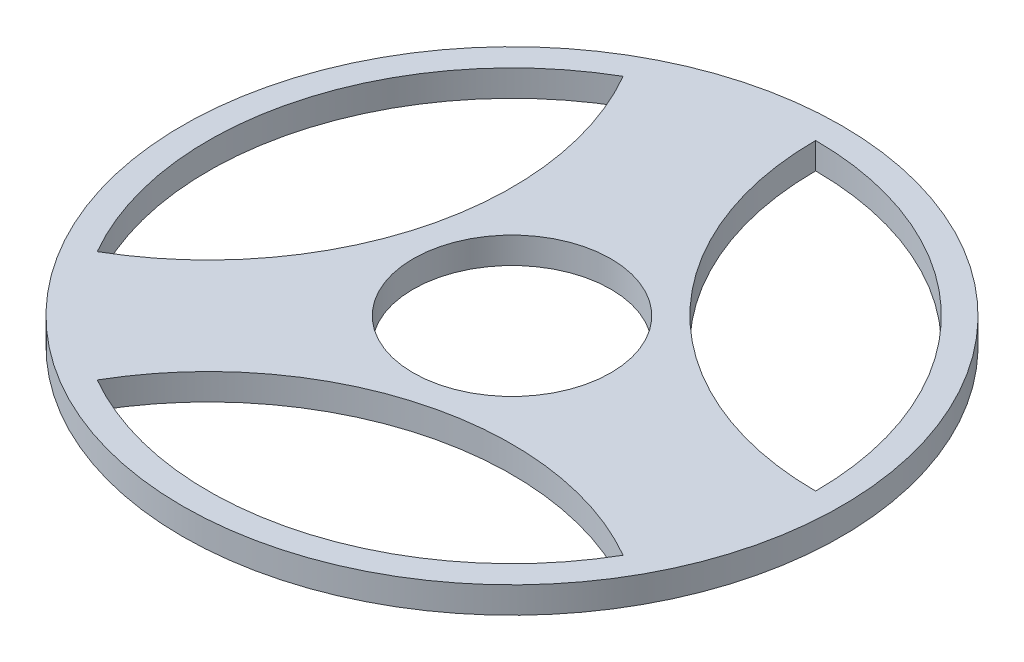
ISO-10303-21;
HEADER;
FILE_DESCRIPTION(('STEP AP214'),'2;1');
FILE_NAME('part.step','',(''),(''),'','','');
FILE_SCHEMA(('AUTOMOTIVE_DESIGN { 1 0 10303 214 1 1 1 1 }'));
ENDSEC;
DATA;
#1=APPLICATION_CONTEXT('core data for automotive mechanical design processes');
#2=APPLICATION_PROTOCOL_DEFINITION('international standard','automotive_design',2000,#1);
#3=PRODUCT_CONTEXT('',#1,'mechanical');
#4=PRODUCT('Part','Part','',(#3));
#5=PRODUCT_RELATED_PRODUCT_CATEGORY('part','',(#4));
#6=PRODUCT_DEFINITION_FORMATION('','',#4);
#7=PRODUCT_DEFINITION_CONTEXT('part definition',#1,'design');
#8=PRODUCT_DEFINITION('design','',#6,#7);
#9=PRODUCT_DEFINITION_SHAPE('','',#8);
#10=(LENGTH_UNIT() NAMED_UNIT(*) SI_UNIT(.MILLI.,.METRE.));
#11=(NAMED_UNIT(*) PLANE_ANGLE_UNIT() SI_UNIT($,.RADIAN.));
#12=(NAMED_UNIT(*) SI_UNIT($,.STERADIAN.) SOLID_ANGLE_UNIT());
#13=UNCERTAINTY_MEASURE_WITH_UNIT(LENGTH_MEASURE(1.E-05),#10,'distance_accuracy_value','');
#14=(GEOMETRIC_REPRESENTATION_CONTEXT(3) GLOBAL_UNCERTAINTY_ASSIGNED_CONTEXT((#13)) GLOBAL_UNIT_ASSIGNED_CONTEXT((#10,
#11,#12)) REPRESENTATION_CONTEXT('',''));
#15=CARTESIAN_POINT('',(0.,0.,0.));
#16=DIRECTION('',(0.,0.,1.));
#17=DIRECTION('',(1.,0.,0.));
#18=AXIS2_PLACEMENT_3D('',#15,#16,#17);
#19=CARTESIAN_POINT('',(460.646839850809,40.,-460.646839850809));
#20=DIRECTION('',(0.,-1.,0.));
#21=DIRECTION('',(0.,0.,-1.));
#22=AXIS2_PLACEMENT_3D('',#19,#20,#21);
#23=CYLINDRICAL_SURFACE('',#22,460.646839850809);
#24=CARTESIAN_POINT('',(460.646839850809,0.,-460.646839850809));
#25=DIRECTION('',(0.,1.,0.));
#26=DIRECTION('',(0.,0.,1.));
#27=AXIS2_PLACEMENT_3D('',#24,#25,#26);
#28=CIRCLE('',#27,460.646839850809);
#29=CARTESIAN_POINT('',(0.,0.,-460.646839850809));
#30=VERTEX_POINT('',#29);
#31=CARTESIAN_POINT('',(460.646839850809,0.,0.));
#32=VERTEX_POINT('',#31);
#33=EDGE_CURVE('E139',#30,#32,#28,.T.);
#34=ORIENTED_EDGE('',*,*,#33,.F.);
#35=DIRECTION('',(0.,-1.,0.));
#36=VECTOR('',#35,1.);
#37=CARTESIAN_POINT('',(0.,40.,-460.646839850809));
#38=LINE('',#37,#36);
#39=CARTESIAN_POINT('',(0.,40.,-460.646839850809));
#40=VERTEX_POINT('',#39);
#41=EDGE_CURVE('E11',#40,#30,#38,.T.);
#42=ORIENTED_EDGE('',*,*,#41,.F.);
#43=CARTESIAN_POINT('',(460.646839850809,40.,-460.646839850809));
#44=DIRECTION('',(0.,1.,0.));
#45=DIRECTION('',(0.,0.,1.));
#46=AXIS2_PLACEMENT_3D('',#43,#44,#45);
#47=CIRCLE('',#46,460.646839850809);
#48=CARTESIAN_POINT('',(460.646839850809,40.,0.));
#49=VERTEX_POINT('',#48);
#50=EDGE_CURVE('E102',#40,#49,#47,.T.);
#51=ORIENTED_EDGE('',*,*,#50,.T.);
#52=DIRECTION('',(0.,-1.,0.));
#53=VECTOR('',#52,1.);
#54=CARTESIAN_POINT('',(460.646839850809,40.,0.));
#55=LINE('',#54,#53);
#56=EDGE_CURVE('E45',#49,#32,#55,.T.);
#57=ORIENTED_EDGE('',*,*,#56,.T.);
#58=EDGE_LOOP('',(#34,#42,#51,#57));
#59=FACE_BOUND('',#58,.T.);
#60=ADVANCED_FACE('F35',(#59),#23,.F.);
#61=CARTESIAN_POINT('',(168.608445558415,40.,629.255285409229));
#62=DIRECTION('',(0.,-1.,0.));
#63=DIRECTION('',(0.,0.,-1.));
#64=AXIS2_PLACEMENT_3D('',#61,#62,#63);
#65=CYLINDRICAL_SURFACE('',#64,460.64683985081);
#66=CARTESIAN_POINT('',(168.608445558415,0.,629.255285409229));
#67=DIRECTION('',(0.,1.,0.));
#68=DIRECTION('',(0.,0.,1.));
#69=AXIS2_PLACEMENT_3D('',#66,#67,#68);
#70=CIRCLE('',#69,460.64683985081);
#71=CARTESIAN_POINT('',(398.931865483822,0.,230.323419925407));
#72=VERTEX_POINT('',#71);
#73=CARTESIAN_POINT('',(-230.323419925406,0.,398.931865483822));
#74=VERTEX_POINT('',#73);
#75=EDGE_CURVE('E136',#72,#74,#70,.T.);
#76=ORIENTED_EDGE('',*,*,#75,.F.);
#77=DIRECTION('',(0.,-1.,0.));
#78=VECTOR('',#77,1.);
#79=CARTESIAN_POINT('',(398.931865483822,40.,230.323419925407));
#80=LINE('',#79,#78);
#81=CARTESIAN_POINT('',(398.931865483822,40.,230.323419925407));
#82=VERTEX_POINT('',#81);
#83=EDGE_CURVE('E112',#82,#72,#80,.T.);
#84=ORIENTED_EDGE('',*,*,#83,.F.);
#85=CARTESIAN_POINT('',(168.608445558415,40.,629.255285409229));
#86=DIRECTION('',(0.,1.,0.));
#87=DIRECTION('',(0.,0.,1.));
#88=AXIS2_PLACEMENT_3D('',#85,#86,#87);
#89=CIRCLE('',#88,460.64683985081);
#90=CARTESIAN_POINT('',(-230.323419925406,40.,398.931865483822));
#91=VERTEX_POINT('',#90);
#92=EDGE_CURVE('E100',#82,#91,#89,.T.);
#93=ORIENTED_EDGE('',*,*,#92,.T.);
#94=DIRECTION('',(0.,-1.,0.));
#95=VECTOR('',#94,1.);
#96=CARTESIAN_POINT('',(-230.323419925406,40.,398.931865483822));
#97=LINE('',#96,#95);
#98=EDGE_CURVE('E105',#91,#74,#97,.T.);
#99=ORIENTED_EDGE('',*,*,#98,.T.);
#100=EDGE_LOOP('',(#76,#84,#93,#99));
#101=FACE_BOUND('',#100,.T.);
#102=ADVANCED_FACE('F114',(#101),#65,.F.);
#103=CARTESIAN_POINT('',(-629.255285409226,40.,-168.608445558424));
#104=DIRECTION('',(0.,-1.,0.));
#105=DIRECTION('',(0.,0.,-1.));
#106=AXIS2_PLACEMENT_3D('',#103,#104,#105);
#107=CYLINDRICAL_SURFACE('',#106,460.646839850809);
#108=CARTESIAN_POINT('',(-629.255285409226,0.,-168.608445558424));
#109=DIRECTION('',(0.,1.,0.));
#110=DIRECTION('',(0.,0.,1.));
#111=AXIS2_PLACEMENT_3D('',#108,#109,#110);
#112=CIRCLE('',#111,460.646839850809);
#113=CARTESIAN_POINT('',(-398.931865483823,0.,230.323419925405));
#114=VERTEX_POINT('',#113);
#115=CARTESIAN_POINT('',(-230.323419925405,0.,-398.931865483823));
#116=VERTEX_POINT('',#115);
#117=EDGE_CURVE('E130',#114,#116,#112,.T.);
#118=ORIENTED_EDGE('',*,*,#117,.F.);
#119=DIRECTION('',(0.,-1.,0.));
#120=VECTOR('',#119,1.);
#121=CARTESIAN_POINT('',(-398.931865483823,40.,230.323419925405));
#122=LINE('',#121,#120);
#123=CARTESIAN_POINT('',(-398.931865483823,40.,230.323419925405));
#124=VERTEX_POINT('',#123);
#125=EDGE_CURVE('E39',#124,#114,#122,.T.);
#126=ORIENTED_EDGE('',*,*,#125,.F.);
#127=CARTESIAN_POINT('',(-629.255285409226,40.,-168.608445558424));
#128=DIRECTION('',(0.,1.,0.));
#129=DIRECTION('',(0.,0.,1.));
#130=AXIS2_PLACEMENT_3D('',#127,#128,#129);
#131=CIRCLE('',#130,460.646839850809);
#132=CARTESIAN_POINT('',(-230.323419925405,40.,-398.931865483823));
#133=VERTEX_POINT('',#132);
#134=EDGE_CURVE('E117',#124,#133,#131,.T.);
#135=ORIENTED_EDGE('',*,*,#134,.T.);
#136=DIRECTION('',(0.,-1.,0.));
#137=VECTOR('',#136,1.);
#138=CARTESIAN_POINT('',(-230.323419925405,40.,-398.931865483823));
#139=LINE('',#138,#137);
#140=EDGE_CURVE('E129',#133,#116,#139,.T.);
#141=ORIENTED_EDGE('',*,*,#140,.T.);
#142=EDGE_LOOP('',(#118,#126,#135,#141));
#143=FACE_BOUND('',#142,.T.);
#144=ADVANCED_FACE('F37',(#143),#107,.F.);
#145=CARTESIAN_POINT('',(0.,40.,0.));
#146=DIRECTION('',(0.,-1.,0.));
#147=DIRECTION('',(0.,0.,-1.));
#148=AXIS2_PLACEMENT_3D('',#145,#146,#147);
#149=CYLINDRICAL_SURFACE('',#148,150.);
#150=CARTESIAN_POINT('',(0.,40.,0.));
#151=DIRECTION('',(0.,1.,0.));
#152=DIRECTION('',(0.,0.,1.));
#153=AXIS2_PLACEMENT_3D('',#150,#151,#152);
#154=CIRCLE('',#153,150.);
#155=CARTESIAN_POINT('',(0.,40.,150.));
#156=VERTEX_POINT('',#155);
#157=EDGE_CURVE('E123',#156,#156,#154,.T.);
#158=ORIENTED_EDGE('',*,*,#157,.T.);
#159=EDGE_LOOP('',(#158));
#160=FACE_BOUND('',#159,.T.);
#161=CARTESIAN_POINT('',(0.,0.,0.));
#162=DIRECTION('',(0.,1.,0.));
#163=DIRECTION('',(0.,0.,1.));
#164=AXIS2_PLACEMENT_3D('',#161,#162,#163);
#165=CIRCLE('',#164,150.);
#166=CARTESIAN_POINT('',(0.,0.,150.));
#167=VERTEX_POINT('',#166);
#168=EDGE_CURVE('E144',#167,#167,#165,.T.);
#169=ORIENTED_EDGE('',*,*,#168,.F.);
#170=EDGE_LOOP('',(#169));
#171=FACE_BOUND('',#170,.T.);
#172=ADVANCED_FACE('F160',(#160,#171),#149,.F.);
#173=CARTESIAN_POINT('',(0.,40.,0.));
#174=DIRECTION('',(0.,-1.,0.));
#175=DIRECTION('',(0.,0.,-1.));
#176=AXIS2_PLACEMENT_3D('',#173,#174,#175);
#177=CYLINDRICAL_SURFACE('',#176,460.646839850809);
#178=CARTESIAN_POINT('',(0.,0.,0.));
#179=DIRECTION('',(0.,1.,0.));
#180=DIRECTION('',(0.,0.,1.));
#181=AXIS2_PLACEMENT_3D('',#178,#179,#180);
#182=CIRCLE('',#181,460.646839850809);
#183=EDGE_CURVE('E142',#30,#32,#182,.F.);
#184=ORIENTED_EDGE('',*,*,#183,.T.);
#185=ORIENTED_EDGE('',*,*,#56,.F.);
#186=CARTESIAN_POINT('',(0.,40.,0.));
#187=DIRECTION('',(0.,1.,0.));
#188=DIRECTION('',(0.,0.,1.));
#189=AXIS2_PLACEMENT_3D('',#186,#187,#188);
#190=CIRCLE('',#189,460.646839850809);
#191=EDGE_CURVE('E53',#40,#49,#190,.F.);
#192=ORIENTED_EDGE('',*,*,#191,.F.);
#193=ORIENTED_EDGE('',*,*,#41,.T.);
#194=EDGE_LOOP('',(#184,#185,#192,#193));
#195=FACE_BOUND('',#194,.T.);
#196=ADVANCED_FACE('F165',(#195),#177,.F.);
#197=CARTESIAN_POINT('',(0.,40.,0.));
#198=DIRECTION('',(0.,-1.,0.));
#199=DIRECTION('',(0.,0.,-1.));
#200=AXIS2_PLACEMENT_3D('',#197,#198,#199);
#201=CYLINDRICAL_SURFACE('',#200,460.64683985081);
#202=CARTESIAN_POINT('',(0.,0.,0.));
#203=DIRECTION('',(0.,1.,0.));
#204=DIRECTION('',(0.,0.,1.));
#205=AXIS2_PLACEMENT_3D('',#202,#203,#204);
#206=CIRCLE('',#205,460.64683985081);
#207=EDGE_CURVE('E108',#72,#74,#206,.F.);
#208=ORIENTED_EDGE('',*,*,#207,.T.);
#209=ORIENTED_EDGE('',*,*,#98,.F.);
#210=CARTESIAN_POINT('',(0.,40.,0.));
#211=DIRECTION('',(0.,1.,0.));
#212=DIRECTION('',(0.,0.,1.));
#213=AXIS2_PLACEMENT_3D('',#210,#211,#212);
#214=CIRCLE('',#213,460.64683985081);
#215=EDGE_CURVE('E96',#82,#91,#214,.F.);
#216=ORIENTED_EDGE('',*,*,#215,.F.);
#217=ORIENTED_EDGE('',*,*,#83,.T.);
#218=EDGE_LOOP('',(#208,#209,#216,#217));
#219=FACE_BOUND('',#218,.T.);
#220=ADVANCED_FACE('F106',(#219),#201,.F.);
#221=CARTESIAN_POINT('',(0.,40.,0.));
#222=DIRECTION('',(0.,-1.,0.));
#223=DIRECTION('',(0.,0.,-1.));
#224=AXIS2_PLACEMENT_3D('',#221,#222,#223);
#225=CYLINDRICAL_SURFACE('',#224,460.646839850809);
#226=CARTESIAN_POINT('',(0.,0.,0.));
#227=DIRECTION('',(0.,1.,0.));
#228=DIRECTION('',(0.,0.,1.));
#229=AXIS2_PLACEMENT_3D('',#226,#227,#228);
#230=CIRCLE('',#229,460.646839850809);
#231=EDGE_CURVE('E133',#114,#116,#230,.F.);
#232=ORIENTED_EDGE('',*,*,#231,.T.);
#233=ORIENTED_EDGE('',*,*,#140,.F.);
#234=CARTESIAN_POINT('',(0.,40.,0.));
#235=DIRECTION('',(0.,1.,0.));
#236=DIRECTION('',(0.,0.,1.));
#237=AXIS2_PLACEMENT_3D('',#234,#235,#236);
#238=CIRCLE('',#237,460.646839850809);
#239=EDGE_CURVE('E115',#124,#133,#238,.F.);
#240=ORIENTED_EDGE('',*,*,#239,.F.);
#241=ORIENTED_EDGE('',*,*,#125,.T.);
#242=EDGE_LOOP('',(#232,#233,#240,#241));
#243=FACE_BOUND('',#242,.T.);
#244=ADVANCED_FACE('F154',(#243),#225,.F.);
#245=CARTESIAN_POINT('',(0.,40.,0.));
#246=DIRECTION('',(0.,-1.,0.));
#247=DIRECTION('',(0.,0.,-1.));
#248=AXIS2_PLACEMENT_3D('',#245,#246,#247);
#249=CYLINDRICAL_SURFACE('',#248,500.);
#250=CARTESIAN_POINT('',(0.,40.,0.));
#251=DIRECTION('',(0.,1.,0.));
#252=DIRECTION('',(0.,0.,1.));
#253=AXIS2_PLACEMENT_3D('',#250,#251,#252);
#254=CIRCLE('',#253,500.);
#255=CARTESIAN_POINT('',(0.,40.,500.));
#256=VERTEX_POINT('',#255);
#257=EDGE_CURVE('E126',#256,#256,#254,.T.);
#258=ORIENTED_EDGE('',*,*,#257,.F.);
#259=EDGE_LOOP('',(#258));
#260=FACE_BOUND('',#259,.T.);
#261=CARTESIAN_POINT('',(0.,0.,0.));
#262=DIRECTION('',(0.,1.,0.));
#263=DIRECTION('',(0.,0.,1.));
#264=AXIS2_PLACEMENT_3D('',#261,#262,#263);
#265=CIRCLE('',#264,500.);
#266=CARTESIAN_POINT('',(0.,0.,500.));
#267=VERTEX_POINT('',#266);
#268=EDGE_CURVE('E147',#267,#267,#265,.T.);
#269=ORIENTED_EDGE('',*,*,#268,.T.);
#270=EDGE_LOOP('',(#269));
#271=FACE_BOUND('',#270,.T.);
#272=ADVANCED_FACE('F177',(#260,#271),#249,.T.);
#273=CARTESIAN_POINT('',(0.,40.,0.));
#274=DIRECTION('',(0.,1.,0.));
#275=DIRECTION('',(0.,0.,1.));
#276=AXIS2_PLACEMENT_3D('',#273,#274,#275);
#277=PLANE('',#276);
#278=ORIENTED_EDGE('',*,*,#134,.F.);
#279=ORIENTED_EDGE('',*,*,#239,.T.);
#280=EDGE_LOOP('',(#278,#279));
#281=FACE_BOUND('',#280,.T.);
#282=ORIENTED_EDGE('',*,*,#92,.F.);
#283=ORIENTED_EDGE('',*,*,#215,.T.);
#284=EDGE_LOOP('',(#282,#283));
#285=FACE_BOUND('',#284,.T.);
#286=ORIENTED_EDGE('',*,*,#50,.F.);
#287=ORIENTED_EDGE('',*,*,#191,.T.);
#288=EDGE_LOOP('',(#286,#287));
#289=FACE_BOUND('',#288,.T.);
#290=ORIENTED_EDGE('',*,*,#157,.F.);
#291=EDGE_LOOP('',(#290));
#292=FACE_BOUND('',#291,.T.);
#293=ORIENTED_EDGE('',*,*,#257,.T.);
#294=EDGE_LOOP('',(#293));
#295=FACE_BOUND('',#294,.T.);
#296=ADVANCED_FACE('F98',(#281,#285,#289,#292,#295),#277,.T.);
#297=CARTESIAN_POINT('',(0.,0.,0.));
#298=DIRECTION('',(0.,1.,0.));
#299=DIRECTION('',(0.,0.,1.));
#300=AXIS2_PLACEMENT_3D('',#297,#298,#299);
#301=PLANE('',#300);
#302=ORIENTED_EDGE('',*,*,#117,.T.);
#303=ORIENTED_EDGE('',*,*,#231,.F.);
#304=EDGE_LOOP('',(#302,#303));
#305=FACE_BOUND('',#304,.T.);
#306=ORIENTED_EDGE('',*,*,#75,.T.);
#307=ORIENTED_EDGE('',*,*,#207,.F.);
#308=EDGE_LOOP('',(#306,#307));
#309=FACE_BOUND('',#308,.T.);
#310=ORIENTED_EDGE('',*,*,#33,.T.);
#311=ORIENTED_EDGE('',*,*,#183,.F.);
#312=EDGE_LOOP('',(#310,#311));
#313=FACE_BOUND('',#312,.T.);
#314=ORIENTED_EDGE('',*,*,#168,.T.);
#315=EDGE_LOOP('',(#314));
#316=FACE_BOUND('',#315,.T.);
#317=ORIENTED_EDGE('',*,*,#268,.F.);
#318=EDGE_LOOP('',(#317));
#319=FACE_BOUND('',#318,.T.);
#320=ADVANCED_FACE('F157',(#305,#309,#313,#316,#319),#301,.F.);
#321=CLOSED_SHELL('',(#60,#102,#144,#172,#196,#220,#244,#272,#296,#320));
#322=MANIFOLD_SOLID_BREP('B2',#321);
#323=ADVANCED_BREP_SHAPE_REPRESENTATION('',(#18,#322),#14);
#324=SHAPE_DEFINITION_REPRESENTATION(#9,#323);
ENDSEC;
END-ISO-10303-21;
